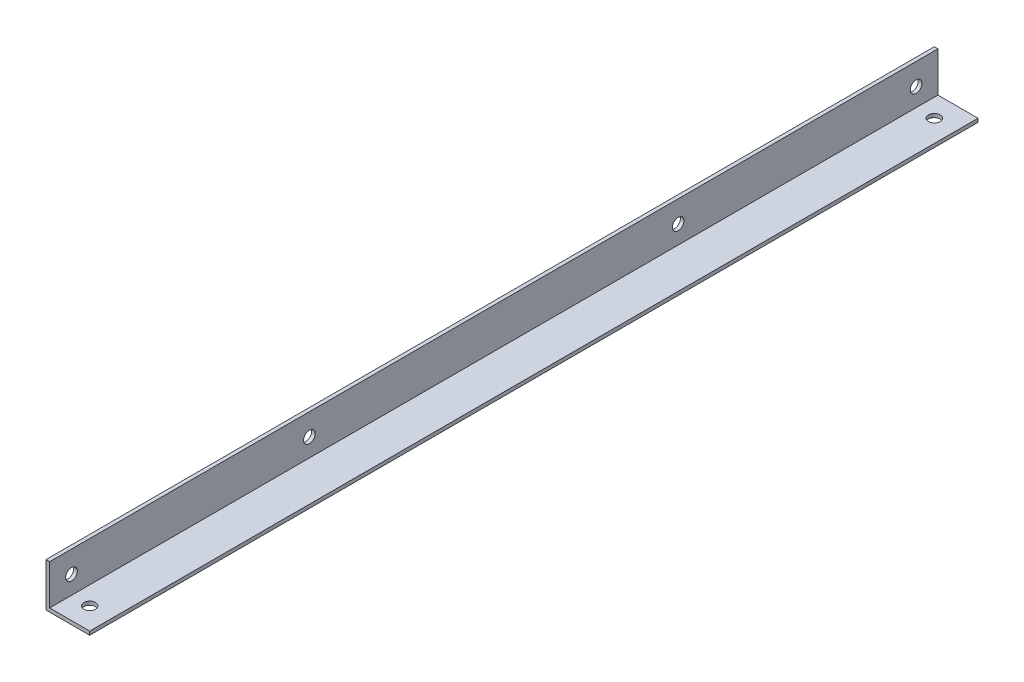
ISO-10303-21;
HEADER;
FILE_DESCRIPTION(('STEP AP214'),'2;1');
FILE_NAME('part.step','',(''),(''),'','','');
FILE_SCHEMA(('AUTOMOTIVE_DESIGN { 1 0 10303 214 1 1 1 1 }'));
ENDSEC;
DATA;
#1=APPLICATION_CONTEXT('core data for automotive mechanical design processes');
#2=APPLICATION_PROTOCOL_DEFINITION('international standard','automotive_design',2000,#1);
#3=PRODUCT_CONTEXT('',#1,'mechanical');
#4=PRODUCT('Part','Part','',(#3));
#5=PRODUCT_RELATED_PRODUCT_CATEGORY('part','',(#4));
#6=PRODUCT_DEFINITION_FORMATION('','',#4);
#7=PRODUCT_DEFINITION_CONTEXT('part definition',#1,'design');
#8=PRODUCT_DEFINITION('design','',#6,#7);
#9=PRODUCT_DEFINITION_SHAPE('','',#8);
#10=(LENGTH_UNIT() NAMED_UNIT(*) SI_UNIT(.MILLI.,.METRE.));
#11=(NAMED_UNIT(*) PLANE_ANGLE_UNIT() SI_UNIT($,.RADIAN.));
#12=(NAMED_UNIT(*) SI_UNIT($,.STERADIAN.) SOLID_ANGLE_UNIT());
#13=UNCERTAINTY_MEASURE_WITH_UNIT(LENGTH_MEASURE(1.E-05),#10,'distance_accuracy_value','');
#14=(GEOMETRIC_REPRESENTATION_CONTEXT(3) GLOBAL_UNCERTAINTY_ASSIGNED_CONTEXT((#13)) GLOBAL_UNIT_ASSIGNED_CONTEXT((#10,
#11,#12)) REPRESENTATION_CONTEXT('',''));
#15=CARTESIAN_POINT('',(0.,0.,0.));
#16=DIRECTION('',(0.,0.,1.));
#17=DIRECTION('',(1.,0.,0.));
#18=AXIS2_PLACEMENT_3D('',#15,#16,#17);
#19=CARTESIAN_POINT('',(30.,0.,609.6));
#20=DIRECTION('',(0.,1.,0.));
#21=DIRECTION('',(-1.,0.,0.));
#22=AXIS2_PLACEMENT_3D('',#19,#20,#21);
#23=PLANE('',#22);
#24=CARTESIAN_POINT('',(14.9999999999999,0.,594.6));
#25=DIRECTION('',(0.,1.,0.));
#26=DIRECTION('',(1.,0.,0.));
#27=AXIS2_PLACEMENT_3D('',#24,#25,#26);
#28=CIRCLE('',#27,3.99999999999995);
#29=CARTESIAN_POINT('',(11.,0.,594.6));
#30=VERTEX_POINT('',#29);
#31=EDGE_CURVE('E163',#30,#30,#28,.T.);
#32=ORIENTED_EDGE('',*,*,#31,.T.);
#33=EDGE_LOOP('',(#32));
#34=FACE_BOUND('',#33,.T.);
#35=CARTESIAN_POINT('',(15.,0.,15.));
#36=DIRECTION('',(0.,1.,0.));
#37=DIRECTION('',(-1.,0.,0.));
#38=AXIS2_PLACEMENT_3D('',#35,#36,#37);
#39=CIRCLE('',#38,4.);
#40=CARTESIAN_POINT('',(11.,0.,15.));
#41=VERTEX_POINT('',#40);
#42=EDGE_CURVE('E166',#41,#41,#39,.T.);
#43=ORIENTED_EDGE('',*,*,#42,.T.);
#44=EDGE_LOOP('',(#43));
#45=FACE_BOUND('',#44,.T.);
#46=DIRECTION('',(1.,0.,0.));
#47=VECTOR('',#46,1.);
#48=CARTESIAN_POINT('',(30.,0.,0.));
#49=LINE('',#48,#47);
#50=CARTESIAN_POINT('',(0.,0.,0.));
#51=VERTEX_POINT('',#50);
#52=CARTESIAN_POINT('',(30.,0.,0.));
#53=VERTEX_POINT('',#52);
#54=EDGE_CURVE('E117',#51,#53,#49,.T.);
#55=ORIENTED_EDGE('',*,*,#54,.T.);
#56=DIRECTION('',(0.,0.,-1.));
#57=VECTOR('',#56,1.);
#58=CARTESIAN_POINT('',(30.,0.,609.6));
#59=LINE('',#58,#57);
#60=CARTESIAN_POINT('',(30.,0.,609.6));
#61=VERTEX_POINT('',#60);
#62=EDGE_CURVE('E11',#61,#53,#59,.T.);
#63=ORIENTED_EDGE('',*,*,#62,.F.);
#64=DIRECTION('',(1.,0.,0.));
#65=VECTOR('',#64,1.);
#66=CARTESIAN_POINT('',(30.,0.,609.6));
#67=LINE('',#66,#65);
#68=CARTESIAN_POINT('',(0.,0.,609.6));
#69=VERTEX_POINT('',#68);
#70=EDGE_CURVE('E128',#69,#61,#67,.T.);
#71=ORIENTED_EDGE('',*,*,#70,.F.);
#72=DIRECTION('',(0.,0.,-1.));
#73=VECTOR('',#72,1.);
#74=CARTESIAN_POINT('',(0.,0.,609.6));
#75=LINE('',#74,#73);
#76=EDGE_CURVE('E113',#69,#51,#75,.T.);
#77=ORIENTED_EDGE('',*,*,#76,.T.);
#78=EDGE_LOOP('',(#55,#63,#71,#77));
#79=FACE_BOUND('',#78,.T.);
#80=ADVANCED_FACE('F33',(#34,#45,#79),#23,.F.);
#81=CARTESIAN_POINT('',(30.,2.5,609.6));
#82=DIRECTION('',(-1.,0.,0.));
#83=DIRECTION('',(0.,0.,1.));
#84=AXIS2_PLACEMENT_3D('',#81,#82,#83);
#85=PLANE('',#84);
#86=DIRECTION('',(0.,1.,0.));
#87=VECTOR('',#86,1.);
#88=CARTESIAN_POINT('',(30.,2.5,0.));
#89=LINE('',#88,#87);
#90=CARTESIAN_POINT('',(30.,2.5,0.));
#91=VERTEX_POINT('',#90);
#92=EDGE_CURVE('E120',#53,#91,#89,.T.);
#93=ORIENTED_EDGE('',*,*,#92,.T.);
#94=DIRECTION('',(0.,0.,-1.));
#95=VECTOR('',#94,1.);
#96=CARTESIAN_POINT('',(30.,2.5,609.6));
#97=LINE('',#96,#95);
#98=CARTESIAN_POINT('',(30.,2.5,609.6));
#99=VERTEX_POINT('',#98);
#100=EDGE_CURVE('E41',#99,#91,#97,.T.);
#101=ORIENTED_EDGE('',*,*,#100,.F.);
#102=DIRECTION('',(0.,1.,0.));
#103=VECTOR('',#102,1.);
#104=CARTESIAN_POINT('',(30.,2.5,609.6));
#105=LINE('',#104,#103);
#106=EDGE_CURVE('E86',#61,#99,#105,.T.);
#107=ORIENTED_EDGE('',*,*,#106,.F.);
#108=ORIENTED_EDGE('',*,*,#62,.T.);
#109=EDGE_LOOP('',(#93,#101,#107,#108));
#110=FACE_BOUND('',#109,.T.);
#111=ADVANCED_FACE('F155',(#110),#85,.F.);
#112=CARTESIAN_POINT('',(2.50000000000001,2.5,609.6));
#113=DIRECTION('',(0.,-1.,0.));
#114=DIRECTION('',(1.,0.,0.));
#115=AXIS2_PLACEMENT_3D('',#112,#113,#114);
#116=PLANE('',#115);
#117=CARTESIAN_POINT('',(14.9999999999999,2.5,594.6));
#118=DIRECTION('',(0.,1.,0.));
#119=DIRECTION('',(1.,0.,0.));
#120=AXIS2_PLACEMENT_3D('',#117,#118,#119);
#121=CIRCLE('',#120,3.99999999999995);
#122=CARTESIAN_POINT('',(11.,2.5,594.6));
#123=VERTEX_POINT('',#122);
#124=EDGE_CURVE('E177',#123,#123,#121,.T.);
#125=ORIENTED_EDGE('',*,*,#124,.F.);
#126=EDGE_LOOP('',(#125));
#127=FACE_BOUND('',#126,.T.);
#128=CARTESIAN_POINT('',(15.,2.5,15.));
#129=DIRECTION('',(0.,1.,0.));
#130=DIRECTION('',(-1.,0.,0.));
#131=AXIS2_PLACEMENT_3D('',#128,#129,#130);
#132=CIRCLE('',#131,4.);
#133=CARTESIAN_POINT('',(11.,2.5,15.));
#134=VERTEX_POINT('',#133);
#135=EDGE_CURVE('E169',#134,#134,#132,.T.);
#136=ORIENTED_EDGE('',*,*,#135,.F.);
#137=EDGE_LOOP('',(#136));
#138=FACE_BOUND('',#137,.T.);
#139=DIRECTION('',(-1.,0.,0.));
#140=VECTOR('',#139,1.);
#141=CARTESIAN_POINT('',(2.50000000000001,2.5,0.));
#142=LINE('',#141,#140);
#143=CARTESIAN_POINT('',(2.50000000000001,2.5,0.));
#144=VERTEX_POINT('',#143);
#145=EDGE_CURVE('E123',#91,#144,#142,.T.);
#146=ORIENTED_EDGE('',*,*,#145,.T.);
#147=DIRECTION('',(0.,0.,-1.));
#148=VECTOR('',#147,1.);
#149=CARTESIAN_POINT('',(2.50000000000001,2.5,609.6));
#150=LINE('',#149,#148);
#151=CARTESIAN_POINT('',(2.50000000000001,2.5,609.6));
#152=VERTEX_POINT('',#151);
#153=EDGE_CURVE('E108',#152,#144,#150,.T.);
#154=ORIENTED_EDGE('',*,*,#153,.F.);
#155=DIRECTION('',(-1.,0.,0.));
#156=VECTOR('',#155,1.);
#157=CARTESIAN_POINT('',(2.50000000000001,2.5,609.6));
#158=LINE('',#157,#156);
#159=EDGE_CURVE('E99',#99,#152,#158,.T.);
#160=ORIENTED_EDGE('',*,*,#159,.F.);
#161=ORIENTED_EDGE('',*,*,#100,.T.);
#162=EDGE_LOOP('',(#146,#154,#160,#161));
#163=FACE_BOUND('',#162,.T.);
#164=ADVANCED_FACE('F134',(#127,#138,#163),#116,.F.);
#165=CARTESIAN_POINT('',(2.5,30.,609.6));
#166=DIRECTION('',(-1.,0.,0.));
#167=DIRECTION('',(0.,-1.,0.));
#168=AXIS2_PLACEMENT_3D('',#165,#166,#167);
#169=PLANE('',#168);
#170=CARTESIAN_POINT('',(2.5,14.9999999999999,178.2565237));
#171=DIRECTION('',(1.,0.,0.));
#172=DIRECTION('',(0.,-1.,0.));
#173=AXIS2_PLACEMENT_3D('',#170,#171,#172);
#174=CIRCLE('',#173,3.99999999999999);
#175=CARTESIAN_POINT('',(2.5,10.9999999999999,178.2565237));
#176=VERTEX_POINT('',#175);
#177=EDGE_CURVE('E168',#176,#176,#174,.T.);
#178=ORIENTED_EDGE('',*,*,#177,.F.);
#179=EDGE_LOOP('',(#178));
#180=FACE_BOUND('',#179,.T.);
#181=CARTESIAN_POINT('',(2.5,14.9999999999999,431.3434763));
#182=DIRECTION('',(1.,0.,0.));
#183=DIRECTION('',(0.,1.,0.));
#184=AXIS2_PLACEMENT_3D('',#181,#182,#183);
#185=CIRCLE('',#184,3.99999999999999);
#186=CARTESIAN_POINT('',(2.5,18.9999999999999,431.3434763));
#187=VERTEX_POINT('',#186);
#188=EDGE_CURVE('E180',#187,#187,#185,.T.);
#189=ORIENTED_EDGE('',*,*,#188,.F.);
#190=EDGE_LOOP('',(#189));
#191=FACE_BOUND('',#190,.T.);
#192=CARTESIAN_POINT('',(2.5,15.,15.));
#193=DIRECTION('',(1.,0.,0.));
#194=DIRECTION('',(0.,-1.,0.));
#195=AXIS2_PLACEMENT_3D('',#192,#193,#194);
#196=CIRCLE('',#195,3.99999999999999);
#197=CARTESIAN_POINT('',(2.5,11.,15.));
#198=VERTEX_POINT('',#197);
#199=EDGE_CURVE('E185',#198,#198,#196,.T.);
#200=ORIENTED_EDGE('',*,*,#199,.F.);
#201=EDGE_LOOP('',(#200));
#202=FACE_BOUND('',#201,.T.);
#203=CARTESIAN_POINT('',(2.5,14.9999999999999,594.6));
#204=DIRECTION('',(1.,0.,0.));
#205=DIRECTION('',(0.,1.,0.));
#206=AXIS2_PLACEMENT_3D('',#203,#204,#205);
#207=CIRCLE('',#206,3.99999999999999);
#208=CARTESIAN_POINT('',(2.5,18.9999999999999,594.6));
#209=VERTEX_POINT('',#208);
#210=EDGE_CURVE('E191',#209,#209,#207,.T.);
#211=ORIENTED_EDGE('',*,*,#210,.F.);
#212=EDGE_LOOP('',(#211));
#213=FACE_BOUND('',#212,.T.);
#214=DIRECTION('',(0.,1.,0.));
#215=VECTOR('',#214,1.);
#216=CARTESIAN_POINT('',(2.5,30.,0.));
#217=LINE('',#216,#215);
#218=CARTESIAN_POINT('',(2.5,30.,0.));
#219=VERTEX_POINT('',#218);
#220=EDGE_CURVE('E107',#144,#219,#217,.T.);
#221=ORIENTED_EDGE('',*,*,#220,.T.);
#222=DIRECTION('',(0.,0.,-1.));
#223=VECTOR('',#222,1.);
#224=CARTESIAN_POINT('',(2.5,30.,609.6));
#225=LINE('',#224,#223);
#226=CARTESIAN_POINT('',(2.5,30.,609.6));
#227=VERTEX_POINT('',#226);
#228=EDGE_CURVE('E104',#227,#219,#225,.T.);
#229=ORIENTED_EDGE('',*,*,#228,.F.);
#230=DIRECTION('',(0.,1.,0.));
#231=VECTOR('',#230,1.);
#232=CARTESIAN_POINT('',(2.5,30.,609.6));
#233=LINE('',#232,#231);
#234=EDGE_CURVE('E93',#152,#227,#233,.T.);
#235=ORIENTED_EDGE('',*,*,#234,.F.);
#236=ORIENTED_EDGE('',*,*,#153,.T.);
#237=EDGE_LOOP('',(#221,#229,#235,#236));
#238=FACE_BOUND('',#237,.T.);
#239=ADVANCED_FACE('F105',(#180,#191,#202,#213,#238),#169,.F.);
#240=CARTESIAN_POINT('',(0.,30.,609.6));
#241=DIRECTION('',(0.,-1.,0.));
#242=DIRECTION('',(0.,0.,-1.));
#243=AXIS2_PLACEMENT_3D('',#240,#241,#242);
#244=PLANE('',#243);
#245=DIRECTION('',(-1.,0.,0.));
#246=VECTOR('',#245,1.);
#247=CARTESIAN_POINT('',(0.,30.,0.));
#248=LINE('',#247,#246);
#249=CARTESIAN_POINT('',(0.,30.,0.));
#250=VERTEX_POINT('',#249);
#251=EDGE_CURVE('E72',#219,#250,#248,.T.);
#252=ORIENTED_EDGE('',*,*,#251,.T.);
#253=DIRECTION('',(0.,0.,-1.));
#254=VECTOR('',#253,1.);
#255=CARTESIAN_POINT('',(0.,30.,609.6));
#256=LINE('',#255,#254);
#257=CARTESIAN_POINT('',(0.,30.,609.6));
#258=VERTEX_POINT('',#257);
#259=EDGE_CURVE('E109',#258,#250,#256,.T.);
#260=ORIENTED_EDGE('',*,*,#259,.F.);
#261=DIRECTION('',(-1.,0.,0.));
#262=VECTOR('',#261,1.);
#263=CARTESIAN_POINT('',(0.,30.,609.6));
#264=LINE('',#263,#262);
#265=EDGE_CURVE('E97',#227,#258,#264,.T.);
#266=ORIENTED_EDGE('',*,*,#265,.F.);
#267=ORIENTED_EDGE('',*,*,#228,.T.);
#268=EDGE_LOOP('',(#252,#260,#266,#267));
#269=FACE_BOUND('',#268,.T.);
#270=ADVANCED_FACE('F111',(#269),#244,.F.);
#271=CARTESIAN_POINT('',(0.,0.,609.6));
#272=DIRECTION('',(1.,0.,0.));
#273=DIRECTION('',(0.,0.,-1.));
#274=AXIS2_PLACEMENT_3D('',#271,#272,#273);
#275=PLANE('',#274);
#276=CARTESIAN_POINT('',(0.,14.9999999999999,178.2565237));
#277=DIRECTION('',(1.,0.,0.));
#278=DIRECTION('',(0.,-1.,0.));
#279=AXIS2_PLACEMENT_3D('',#276,#277,#278);
#280=CIRCLE('',#279,3.99999999999999);
#281=CARTESIAN_POINT('',(0.,10.9999999999999,178.2565237));
#282=VERTEX_POINT('',#281);
#283=EDGE_CURVE('E172',#282,#282,#280,.T.);
#284=ORIENTED_EDGE('',*,*,#283,.T.);
#285=EDGE_LOOP('',(#284));
#286=FACE_BOUND('',#285,.T.);
#287=CARTESIAN_POINT('',(0.,14.9999999999999,431.3434763));
#288=DIRECTION('',(1.,0.,0.));
#289=DIRECTION('',(0.,1.,0.));
#290=AXIS2_PLACEMENT_3D('',#287,#288,#289);
#291=CIRCLE('',#290,3.99999999999999);
#292=CARTESIAN_POINT('',(0.,18.9999999999999,431.3434763));
#293=VERTEX_POINT('',#292);
#294=EDGE_CURVE('E182',#293,#293,#291,.T.);
#295=ORIENTED_EDGE('',*,*,#294,.T.);
#296=EDGE_LOOP('',(#295));
#297=FACE_BOUND('',#296,.T.);
#298=CARTESIAN_POINT('',(0.,15.,15.));
#299=DIRECTION('',(1.,0.,0.));
#300=DIRECTION('',(0.,-1.,0.));
#301=AXIS2_PLACEMENT_3D('',#298,#299,#300);
#302=CIRCLE('',#301,3.99999999999999);
#303=CARTESIAN_POINT('',(0.,11.,15.));
#304=VERTEX_POINT('',#303);
#305=EDGE_CURVE('E188',#304,#304,#302,.T.);
#306=ORIENTED_EDGE('',*,*,#305,.T.);
#307=EDGE_LOOP('',(#306));
#308=FACE_BOUND('',#307,.T.);
#309=CARTESIAN_POINT('',(0.,14.9999999999999,594.6));
#310=DIRECTION('',(1.,0.,0.));
#311=DIRECTION('',(0.,1.,0.));
#312=AXIS2_PLACEMENT_3D('',#309,#310,#311);
#313=CIRCLE('',#312,3.99999999999999);
#314=CARTESIAN_POINT('',(0.,18.9999999999999,594.6));
#315=VERTEX_POINT('',#314);
#316=EDGE_CURVE('E121',#315,#315,#313,.T.);
#317=ORIENTED_EDGE('',*,*,#316,.T.);
#318=EDGE_LOOP('',(#317));
#319=FACE_BOUND('',#318,.T.);
#320=DIRECTION('',(0.,-1.,0.));
#321=VECTOR('',#320,1.);
#322=CARTESIAN_POINT('',(0.,0.,0.));
#323=LINE('',#322,#321);
#324=EDGE_CURVE('E78',#250,#51,#323,.T.);
#325=ORIENTED_EDGE('',*,*,#324,.T.);
#326=ORIENTED_EDGE('',*,*,#76,.F.);
#327=DIRECTION('',(0.,-1.,0.));
#328=VECTOR('',#327,1.);
#329=CARTESIAN_POINT('',(0.,0.,609.6));
#330=LINE('',#329,#328);
#331=EDGE_CURVE('E49',#258,#69,#330,.T.);
#332=ORIENTED_EDGE('',*,*,#331,.F.);
#333=ORIENTED_EDGE('',*,*,#259,.T.);
#334=EDGE_LOOP('',(#325,#326,#332,#333));
#335=FACE_BOUND('',#334,.T.);
#336=ADVANCED_FACE('F141',(#286,#297,#308,#319,#335),#275,.F.);
#337=CARTESIAN_POINT('',(0.,0.,609.6));
#338=DIRECTION('',(0.,0.,-1.));
#339=DIRECTION('',(-1.,0.,0.));
#340=AXIS2_PLACEMENT_3D('',#337,#338,#339);
#341=PLANE('',#340);
#342=ORIENTED_EDGE('',*,*,#70,.T.);
#343=ORIENTED_EDGE('',*,*,#106,.T.);
#344=ORIENTED_EDGE('',*,*,#159,.T.);
#345=ORIENTED_EDGE('',*,*,#234,.T.);
#346=ORIENTED_EDGE('',*,*,#265,.T.);
#347=ORIENTED_EDGE('',*,*,#331,.T.);
#348=EDGE_LOOP('',(#342,#343,#344,#345,#346,#347));
#349=FACE_BOUND('',#348,.T.);
#350=ADVANCED_FACE('F95',(#349),#341,.F.);
#351=CARTESIAN_POINT('',(0.,0.,0.));
#352=DIRECTION('',(0.,0.,-1.));
#353=DIRECTION('',(-1.,0.,0.));
#354=AXIS2_PLACEMENT_3D('',#351,#352,#353);
#355=PLANE('',#354);
#356=ORIENTED_EDGE('',*,*,#54,.F.);
#357=ORIENTED_EDGE('',*,*,#324,.F.);
#358=ORIENTED_EDGE('',*,*,#251,.F.);
#359=ORIENTED_EDGE('',*,*,#220,.F.);
#360=ORIENTED_EDGE('',*,*,#145,.F.);
#361=ORIENTED_EDGE('',*,*,#92,.F.);
#362=EDGE_LOOP('',(#356,#357,#358,#359,#360,#361));
#363=FACE_BOUND('',#362,.T.);
#364=ADVANCED_FACE('F137',(#363),#355,.T.);
#365=CARTESIAN_POINT('',(0.,14.9999999999999,594.6));
#366=DIRECTION('',(1.,0.,0.));
#367=DIRECTION('',(0.,1.,0.));
#368=AXIS2_PLACEMENT_3D('',#365,#366,#367);
#369=CYLINDRICAL_SURFACE('',#368,3.99999999999999);
#370=ORIENTED_EDGE('',*,*,#316,.F.);
#371=EDGE_LOOP('',(#370));
#372=FACE_BOUND('',#371,.T.);
#373=ORIENTED_EDGE('',*,*,#210,.T.);
#374=EDGE_LOOP('',(#373));
#375=FACE_BOUND('',#374,.T.);
#376=ADVANCED_FACE('F201',(#372,#375),#369,.F.);
#377=CARTESIAN_POINT('',(0.,15.,15.));
#378=DIRECTION('',(1.,0.,0.));
#379=DIRECTION('',(0.,1.,0.));
#380=AXIS2_PLACEMENT_3D('',#377,#378,#379);
#381=CYLINDRICAL_SURFACE('',#380,3.99999999999999);
#382=ORIENTED_EDGE('',*,*,#305,.F.);
#383=EDGE_LOOP('',(#382));
#384=FACE_BOUND('',#383,.T.);
#385=ORIENTED_EDGE('',*,*,#199,.T.);
#386=EDGE_LOOP('',(#385));
#387=FACE_BOUND('',#386,.T.);
#388=ADVANCED_FACE('F217',(#384,#387),#381,.F.);
#389=CARTESIAN_POINT('',(0.,14.9999999999999,431.3434763));
#390=DIRECTION('',(1.,0.,0.));
#391=DIRECTION('',(0.,1.,0.));
#392=AXIS2_PLACEMENT_3D('',#389,#390,#391);
#393=CYLINDRICAL_SURFACE('',#392,3.99999999999999);
#394=ORIENTED_EDGE('',*,*,#294,.F.);
#395=EDGE_LOOP('',(#394));
#396=FACE_BOUND('',#395,.T.);
#397=ORIENTED_EDGE('',*,*,#188,.T.);
#398=EDGE_LOOP('',(#397));
#399=FACE_BOUND('',#398,.T.);
#400=ADVANCED_FACE('F219',(#396,#399),#393,.F.);
#401=CARTESIAN_POINT('',(0.,14.9999999999999,178.2565237));
#402=DIRECTION('',(1.,0.,0.));
#403=DIRECTION('',(0.,1.,0.));
#404=AXIS2_PLACEMENT_3D('',#401,#402,#403);
#405=CYLINDRICAL_SURFACE('',#404,3.99999999999999);
#406=ORIENTED_EDGE('',*,*,#283,.F.);
#407=EDGE_LOOP('',(#406));
#408=FACE_BOUND('',#407,.T.);
#409=ORIENTED_EDGE('',*,*,#177,.T.);
#410=EDGE_LOOP('',(#409));
#411=FACE_BOUND('',#410,.T.);
#412=ADVANCED_FACE('F226',(#408,#411),#405,.F.);
#413=CARTESIAN_POINT('',(15.,0.,15.));
#414=DIRECTION('',(0.,1.,0.));
#415=DIRECTION('',(-1.,0.,0.));
#416=AXIS2_PLACEMENT_3D('',#413,#414,#415);
#417=CYLINDRICAL_SURFACE('',#416,4.);
#418=CARTESIAN_POINT('',(11.,0.,15.));
#419=CARTESIAN_POINT('',(11.,0.0260416666666613,15.));
#420=CARTESIAN_POINT('',(11.,0.052083333333328,15.));
#421=CARTESIAN_POINT('',(11.,0.104166666666661,15.));
#422=CARTESIAN_POINT('',(11.,0.130208333333328,15.));
#423=CARTESIAN_POINT('',(11.,0.182291666666662,15.));
#424=CARTESIAN_POINT('',(11.,0.208333333333328,15.));
#425=CARTESIAN_POINT('',(11.,0.260416666666662,15.));
#426=CARTESIAN_POINT('',(11.,0.286458333333328,15.));
#427=CARTESIAN_POINT('',(11.,0.338541666666662,15.));
#428=CARTESIAN_POINT('',(11.,0.364583333333329,15.));
#429=CARTESIAN_POINT('',(11.,0.416666666666662,15.));
#430=CARTESIAN_POINT('',(11.,0.442708333333329,15.));
#431=CARTESIAN_POINT('',(11.,0.494791666666662,15.));
#432=CARTESIAN_POINT('',(11.,0.520833333333329,15.));
#433=CARTESIAN_POINT('',(11.,0.572916666666662,15.));
#434=CARTESIAN_POINT('',(11.,0.598958333333329,15.));
#435=CARTESIAN_POINT('',(11.,0.651041666666663,15.));
#436=CARTESIAN_POINT('',(11.,0.677083333333329,15.));
#437=CARTESIAN_POINT('',(11.,0.729166666666663,15.));
#438=CARTESIAN_POINT('',(11.,0.755208333333329,15.));
#439=CARTESIAN_POINT('',(11.,0.807291666666663,15.));
#440=CARTESIAN_POINT('',(11.,0.83333333333333,15.));
#441=CARTESIAN_POINT('',(11.,0.885416666666663,15.));
#442=CARTESIAN_POINT('',(11.,0.91145833333333,15.));
#443=CARTESIAN_POINT('',(11.,0.963541666666663,15.));
#444=CARTESIAN_POINT('',(11.,0.98958333333333,15.));
#445=CARTESIAN_POINT('',(11.,1.04166666666666,15.));
#446=CARTESIAN_POINT('',(11.,1.06770833333333,15.));
#447=CARTESIAN_POINT('',(11.,1.11979166666666,15.));
#448=CARTESIAN_POINT('',(11.,1.14583333333333,15.));
#449=CARTESIAN_POINT('',(11.,1.19791666666666,15.));
#450=CARTESIAN_POINT('',(11.,1.22395833333333,15.));
#451=CARTESIAN_POINT('',(11.,1.27604166666666,15.));
#452=CARTESIAN_POINT('',(11.,1.30208333333333,15.));
#453=CARTESIAN_POINT('',(11.,1.35416666666666,15.));
#454=CARTESIAN_POINT('',(11.,1.38020833333333,15.));
#455=CARTESIAN_POINT('',(11.,1.43229166666666,15.));
#456=CARTESIAN_POINT('',(11.,1.45833333333333,15.));
#457=CARTESIAN_POINT('',(11.,1.51041666666666,15.));
#458=CARTESIAN_POINT('',(11.,1.53645833333333,15.));
#459=CARTESIAN_POINT('',(11.,1.58854166666666,15.));
#460=CARTESIAN_POINT('',(11.,1.61458333333333,15.));
#461=CARTESIAN_POINT('',(11.,1.66666666666666,15.));
#462=CARTESIAN_POINT('',(11.,1.69270833333333,15.));
#463=CARTESIAN_POINT('',(11.,1.74479166666667,15.));
#464=CARTESIAN_POINT('',(11.,1.77083333333333,15.));
#465=CARTESIAN_POINT('',(11.,1.82291666666667,15.));
#466=CARTESIAN_POINT('',(11.,1.84895833333333,15.));
#467=CARTESIAN_POINT('',(11.,1.90104166666667,15.));
#468=CARTESIAN_POINT('',(11.,1.92708333333333,15.));
#469=CARTESIAN_POINT('',(11.,1.97916666666667,15.));
#470=CARTESIAN_POINT('',(11.,2.00520833333333,15.));
#471=CARTESIAN_POINT('',(11.,2.05729166666667,15.));
#472=CARTESIAN_POINT('',(11.,2.08333333333333,15.));
#473=CARTESIAN_POINT('',(11.,2.13541666666667,15.));
#474=CARTESIAN_POINT('',(11.,2.16145833333333,15.));
#475=CARTESIAN_POINT('',(11.,2.21354166666667,15.));
#476=CARTESIAN_POINT('',(11.,2.23958333333333,15.));
#477=CARTESIAN_POINT('',(11.,2.29166666666667,15.));
#478=CARTESIAN_POINT('',(11.,2.31770833333333,15.));
#479=CARTESIAN_POINT('',(11.,2.36979166666667,15.));
#480=CARTESIAN_POINT('',(11.,2.39583333333333,15.));
#481=CARTESIAN_POINT('',(11.,2.44791666666667,15.));
#482=CARTESIAN_POINT('',(11.,2.47395833333333,15.));
#483=CARTESIAN_POINT('',(11.,2.5,15.));
#484=B_SPLINE_CURVE_WITH_KNOTS('',3,(#418,#419,#420,#421,#422,#423,#424,#425,#426,#427,#428,
#429,#430,#431,#432,#433,#434,#435,#436,#437,#438,#439,#440,#441,#442,#443,#444,#445,#446,#447,
#448,#449,#450,#451,#452,#453,#454,#455,#456,#457,#458,#459,#460,#461,#462,#463,#464,#465,#466,
#467,#468,#469,#470,#471,#472,#473,#474,#475,#476,#477,#478,#479,#480,#481,#482,#483),
.UNSPECIFIED.,.F.,.F.,(4,2,2,2,2,2,2,2,2,2,2,2,2,2,2,2,2,2,2,2,2,2,2,2,2,2,2,2,2,2,2,2,4),(0.,
0.0781250000000002,0.15625,0.234375,0.312500000000001,0.390625000000001,0.468750000000001,
0.546875000000001,0.625000000000001,0.703125000000001,0.781250000000002,0.859375000000002,
0.937500000000002,1.015625,1.09375,1.171875,1.25,1.328125,1.40625,1.484375,1.5625,1.640625,
1.71875,1.796875,1.875,1.953125,2.03125,2.109375,2.1875,2.265625,2.34375,2.421875,2.5),.UNSPECIFIED.);
#485=EDGE_CURVE('BSEAM262',#41,#134,#484,.T.);
#486=ORIENTED_EDGE('',*,*,#42,.F.);
#487=ORIENTED_EDGE('',*,*,#135,.T.);
#488=ORIENTED_EDGE('',*,*,#485,.T.);
#489=ORIENTED_EDGE('',*,*,#485,.F.);
#490=EDGE_LOOP('',(#486,#488,#487,#489));
#491=FACE_BOUND('',#490,.T.);
#492=ADVANCED_FACE('F262',(#491),#417,.F.);
#493=CARTESIAN_POINT('',(14.9999999999999,0.,594.6));
#494=DIRECTION('',(0.,1.,0.));
#495=DIRECTION('',(-1.,0.,0.));
#496=AXIS2_PLACEMENT_3D('',#493,#494,#495);
#497=CYLINDRICAL_SURFACE('',#496,3.99999999999995);
#498=CARTESIAN_POINT('',(11.,0.,594.6));
#499=CARTESIAN_POINT('',(11.,0.0260416666666613,594.6));
#500=CARTESIAN_POINT('',(11.,0.052083333333328,594.6));
#501=CARTESIAN_POINT('',(11.,0.104166666666661,594.6));
#502=CARTESIAN_POINT('',(11.,0.130208333333328,594.6));
#503=CARTESIAN_POINT('',(11.,0.182291666666662,594.6));
#504=CARTESIAN_POINT('',(11.,0.208333333333328,594.6));
#505=CARTESIAN_POINT('',(11.,0.260416666666662,594.6));
#506=CARTESIAN_POINT('',(11.,0.286458333333328,594.6));
#507=CARTESIAN_POINT('',(11.,0.338541666666662,594.6));
#508=CARTESIAN_POINT('',(11.,0.364583333333329,594.6));
#509=CARTESIAN_POINT('',(11.,0.416666666666662,594.6));
#510=CARTESIAN_POINT('',(11.,0.442708333333329,594.6));
#511=CARTESIAN_POINT('',(11.,0.494791666666662,594.6));
#512=CARTESIAN_POINT('',(11.,0.520833333333329,594.6));
#513=CARTESIAN_POINT('',(11.,0.572916666666662,594.6));
#514=CARTESIAN_POINT('',(11.,0.598958333333329,594.6));
#515=CARTESIAN_POINT('',(11.,0.651041666666663,594.6));
#516=CARTESIAN_POINT('',(11.,0.677083333333329,594.6));
#517=CARTESIAN_POINT('',(11.,0.729166666666663,594.6));
#518=CARTESIAN_POINT('',(11.,0.755208333333329,594.6));
#519=CARTESIAN_POINT('',(11.,0.807291666666663,594.6));
#520=CARTESIAN_POINT('',(11.,0.83333333333333,594.6));
#521=CARTESIAN_POINT('',(11.,0.885416666666663,594.6));
#522=CARTESIAN_POINT('',(11.,0.91145833333333,594.6));
#523=CARTESIAN_POINT('',(11.,0.963541666666663,594.6));
#524=CARTESIAN_POINT('',(11.,0.98958333333333,594.6));
#525=CARTESIAN_POINT('',(11.,1.04166666666666,594.6));
#526=CARTESIAN_POINT('',(11.,1.06770833333333,594.6));
#527=CARTESIAN_POINT('',(11.,1.11979166666666,594.6));
#528=CARTESIAN_POINT('',(11.,1.14583333333333,594.6));
#529=CARTESIAN_POINT('',(11.,1.19791666666666,594.6));
#530=CARTESIAN_POINT('',(11.,1.22395833333333,594.6));
#531=CARTESIAN_POINT('',(11.,1.27604166666666,594.6));
#532=CARTESIAN_POINT('',(11.,1.30208333333333,594.6));
#533=CARTESIAN_POINT('',(11.,1.35416666666666,594.6));
#534=CARTESIAN_POINT('',(11.,1.38020833333333,594.6));
#535=CARTESIAN_POINT('',(11.,1.43229166666666,594.6));
#536=CARTESIAN_POINT('',(11.,1.45833333333333,594.6));
#537=CARTESIAN_POINT('',(11.,1.51041666666666,594.6));
#538=CARTESIAN_POINT('',(11.,1.53645833333333,594.6));
#539=CARTESIAN_POINT('',(11.,1.58854166666666,594.6));
#540=CARTESIAN_POINT('',(11.,1.61458333333333,594.6));
#541=CARTESIAN_POINT('',(11.,1.66666666666666,594.6));
#542=CARTESIAN_POINT('',(11.,1.69270833333333,594.6));
#543=CARTESIAN_POINT('',(11.,1.74479166666667,594.6));
#544=CARTESIAN_POINT('',(11.,1.77083333333333,594.6));
#545=CARTESIAN_POINT('',(11.,1.82291666666667,594.6));
#546=CARTESIAN_POINT('',(11.,1.84895833333333,594.6));
#547=CARTESIAN_POINT('',(11.,1.90104166666667,594.6));
#548=CARTESIAN_POINT('',(11.,1.92708333333333,594.6));
#549=CARTESIAN_POINT('',(11.,1.97916666666667,594.6));
#550=CARTESIAN_POINT('',(11.,2.00520833333333,594.6));
#551=CARTESIAN_POINT('',(11.,2.05729166666667,594.6));
#552=CARTESIAN_POINT('',(11.,2.08333333333333,594.6));
#553=CARTESIAN_POINT('',(11.,2.13541666666667,594.6));
#554=CARTESIAN_POINT('',(11.,2.16145833333333,594.6));
#555=CARTESIAN_POINT('',(11.,2.21354166666667,594.6));
#556=CARTESIAN_POINT('',(11.,2.23958333333333,594.6));
#557=CARTESIAN_POINT('',(11.,2.29166666666667,594.6));
#558=CARTESIAN_POINT('',(11.,2.31770833333333,594.6));
#559=CARTESIAN_POINT('',(11.,2.36979166666667,594.6));
#560=CARTESIAN_POINT('',(11.,2.39583333333333,594.6));
#561=CARTESIAN_POINT('',(11.,2.44791666666667,594.6));
#562=CARTESIAN_POINT('',(11.,2.47395833333333,594.6));
#563=CARTESIAN_POINT('',(11.,2.5,594.6));
#564=B_SPLINE_CURVE_WITH_KNOTS('',3,(#498,#499,#500,#501,#502,#503,#504,#505,#506,#507,#508,
#509,#510,#511,#512,#513,#514,#515,#516,#517,#518,#519,#520,#521,#522,#523,#524,#525,#526,#527,
#528,#529,#530,#531,#532,#533,#534,#535,#536,#537,#538,#539,#540,#541,#542,#543,#544,#545,#546,
#547,#548,#549,#550,#551,#552,#553,#554,#555,#556,#557,#558,#559,#560,#561,#562,#563),
.UNSPECIFIED.,.F.,.F.,(4,2,2,2,2,2,2,2,2,2,2,2,2,2,2,2,2,2,2,2,2,2,2,2,2,2,2,2,2,2,2,2,4),(0.,
0.0781250000000002,0.15625,0.234375,0.312500000000001,0.390625000000001,0.468750000000001,
0.546875000000001,0.625000000000001,0.703125000000001,0.781250000000002,0.859375000000002,
0.937500000000002,1.015625,1.09375,1.171875,1.25,1.328125,1.40625,1.484375,1.5625,1.640625,
1.71875,1.796875,1.875,1.953125,2.03125,2.109375,2.1875,2.265625,2.34375,2.421875,2.5),.UNSPECIFIED.);
#565=EDGE_CURVE('BSEAM284',#30,#123,#564,.T.);
#566=ORIENTED_EDGE('',*,*,#31,.F.);
#567=ORIENTED_EDGE('',*,*,#124,.T.);
#568=ORIENTED_EDGE('',*,*,#565,.T.);
#569=ORIENTED_EDGE('',*,*,#565,.F.);
#570=EDGE_LOOP('',(#566,#568,#567,#569));
#571=FACE_BOUND('',#570,.T.);
#572=ADVANCED_FACE('F284',(#571),#497,.F.);
#573=CLOSED_SHELL('',(#80,#111,#164,#239,#270,#336,#350,#364,#376,#388,#400,#412,#492,#572));
#574=MANIFOLD_SOLID_BREP('B2',#573);
#575=ADVANCED_BREP_SHAPE_REPRESENTATION('',(#18,#574),#14);
#576=SHAPE_DEFINITION_REPRESENTATION(#9,#575);
ENDSEC;
END-ISO-10303-21;
